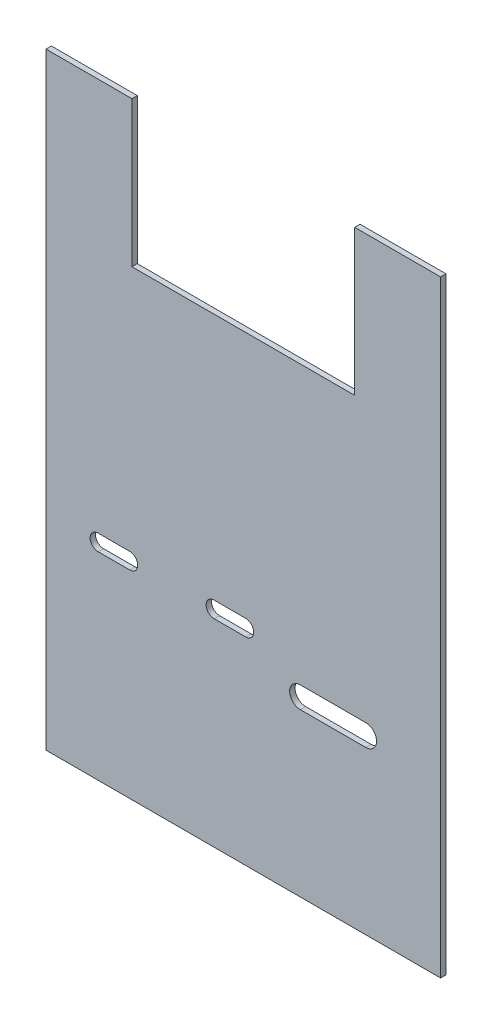
ISO-10303-21;
HEADER;
FILE_DESCRIPTION(('STEP AP214'),'2;1');
FILE_NAME('part.step','',(''),(''),'','','');
FILE_SCHEMA(('AUTOMOTIVE_DESIGN { 1 0 10303 214 1 1 1 1 }'));
ENDSEC;
DATA;
#1=APPLICATION_CONTEXT('core data for automotive mechanical design processes');
#2=APPLICATION_PROTOCOL_DEFINITION('international standard','automotive_design',2000,#1);
#3=PRODUCT_CONTEXT('',#1,'mechanical');
#4=PRODUCT('Part','Part','',(#3));
#5=PRODUCT_RELATED_PRODUCT_CATEGORY('part','',(#4));
#6=PRODUCT_DEFINITION_FORMATION('','',#4);
#7=PRODUCT_DEFINITION_CONTEXT('part definition',#1,'design');
#8=PRODUCT_DEFINITION('design','',#6,#7);
#9=PRODUCT_DEFINITION_SHAPE('','',#8);
#10=(LENGTH_UNIT() NAMED_UNIT(*) SI_UNIT(.MILLI.,.METRE.));
#11=(NAMED_UNIT(*) PLANE_ANGLE_UNIT() SI_UNIT($,.RADIAN.));
#12=(NAMED_UNIT(*) SI_UNIT($,.STERADIAN.) SOLID_ANGLE_UNIT());
#13=UNCERTAINTY_MEASURE_WITH_UNIT(LENGTH_MEASURE(1.E-05),#10,'distance_accuracy_value','');
#14=(GEOMETRIC_REPRESENTATION_CONTEXT(3) GLOBAL_UNCERTAINTY_ASSIGNED_CONTEXT((#13)) GLOBAL_UNIT_ASSIGNED_CONTEXT((#10,
#11,#12)) REPRESENTATION_CONTEXT('',''));
#15=CARTESIAN_POINT('',(0.,0.,0.));
#16=DIRECTION('',(0.,0.,1.));
#17=DIRECTION('',(1.,0.,0.));
#18=AXIS2_PLACEMENT_3D('',#15,#16,#17);
#19=CARTESIAN_POINT('',(-115.,62.1191618381226,2.));
#20=DIRECTION('',(1.,0.,0.));
#21=DIRECTION('',(0.,0.,-1.));
#22=AXIS2_PLACEMENT_3D('',#19,#20,#21);
#23=PLANE('',#22);
#24=DIRECTION('',(0.,-1.,0.));
#25=VECTOR('',#24,1.);
#26=CARTESIAN_POINT('',(-115.,62.1191618381226,0.));
#27=LINE('',#26,#25);
#28=CARTESIAN_POINT('',(-115.,116.342711696557,0.));
#29=VERTEX_POINT('',#28);
#30=CARTESIAN_POINT('',(-115.,-109.880838161877,0.));
#31=VERTEX_POINT('',#30);
#32=EDGE_CURVE('E207',#29,#31,#27,.T.);
#33=ORIENTED_EDGE('',*,*,#32,.T.);
#34=DIRECTION('',(0.,0.,-1.));
#35=VECTOR('',#34,1.);
#36=CARTESIAN_POINT('',(-115.,-109.880838161877,2.));
#37=LINE('',#36,#35);
#38=CARTESIAN_POINT('',(-115.,-109.880838161877,2.));
#39=VERTEX_POINT('',#38);
#40=EDGE_CURVE('E11',#39,#31,#37,.T.);
#41=ORIENTED_EDGE('',*,*,#40,.F.);
#42=DIRECTION('',(0.,-1.,0.));
#43=VECTOR('',#42,1.);
#44=CARTESIAN_POINT('',(-115.,116.342711696557,2.));
#45=LINE('',#44,#43);
#46=CARTESIAN_POINT('',(-115.,116.342711696557,2.));
#47=VERTEX_POINT('',#46);
#48=EDGE_CURVE('E272',#47,#39,#45,.T.);
#49=ORIENTED_EDGE('',*,*,#48,.F.);
#50=DIRECTION('',(0.,0.,-1.));
#51=VECTOR('',#50,1.);
#52=CARTESIAN_POINT('',(-115.,116.342711696557,2.));
#53=LINE('',#52,#51);
#54=EDGE_CURVE('E289',#47,#29,#53,.T.);
#55=ORIENTED_EDGE('',*,*,#54,.T.);
#56=EDGE_LOOP('',(#33,#41,#49,#55));
#57=FACE_BOUND('',#56,.T.);
#58=ADVANCED_FACE('F34',(#57),#23,.F.);
#59=CARTESIAN_POINT('',(-115.,-109.880838161877,2.));
#60=DIRECTION('',(0.,1.,0.));
#61=DIRECTION('',(0.,0.,1.));
#62=AXIS2_PLACEMENT_3D('',#59,#60,#61);
#63=PLANE('',#62);
#64=DIRECTION('',(1.,0.,0.));
#65=VECTOR('',#64,1.);
#66=CARTESIAN_POINT('',(-115.,-109.880838161877,0.));
#67=LINE('',#66,#65);
#68=CARTESIAN_POINT('',(32.0000000000001,-109.880838161877,0.));
#69=VERTEX_POINT('',#68);
#70=EDGE_CURVE('E291',#31,#69,#67,.T.);
#71=ORIENTED_EDGE('',*,*,#70,.T.);
#72=DIRECTION('',(0.,0.,-1.));
#73=VECTOR('',#72,1.);
#74=CARTESIAN_POINT('',(32.0000000000001,-109.880838161877,2.));
#75=LINE('',#74,#73);
#76=CARTESIAN_POINT('',(32.0000000000001,-109.880838161877,2.));
#77=VERTEX_POINT('',#76);
#78=EDGE_CURVE('E41',#77,#69,#75,.T.);
#79=ORIENTED_EDGE('',*,*,#78,.F.);
#80=DIRECTION('',(1.,0.,0.));
#81=VECTOR('',#80,1.);
#82=CARTESIAN_POINT('',(-115.,-109.880838161877,2.));
#83=LINE('',#82,#81);
#84=EDGE_CURVE('E274',#39,#77,#83,.T.);
#85=ORIENTED_EDGE('',*,*,#84,.F.);
#86=ORIENTED_EDGE('',*,*,#40,.T.);
#87=EDGE_LOOP('',(#71,#79,#85,#86));
#88=FACE_BOUND('',#87,.T.);
#89=ADVANCED_FACE('F330',(#88),#63,.F.);
#90=CARTESIAN_POINT('',(32.,116.342711696557,2.));
#91=DIRECTION('',(-1.,0.,0.));
#92=DIRECTION('',(0.,-1.,0.));
#93=AXIS2_PLACEMENT_3D('',#90,#91,#92);
#94=PLANE('',#93);
#95=DIRECTION('',(0.,1.,0.));
#96=VECTOR('',#95,1.);
#97=CARTESIAN_POINT('',(32.,116.342711696557,0.));
#98=LINE('',#97,#96);
#99=CARTESIAN_POINT('',(32.,116.342711696557,0.));
#100=VERTEX_POINT('',#99);
#101=EDGE_CURVE('E294',#69,#100,#98,.T.);
#102=ORIENTED_EDGE('',*,*,#101,.T.);
#103=DIRECTION('',(0.,0.,-1.));
#104=VECTOR('',#103,1.);
#105=CARTESIAN_POINT('',(32.,116.342711696557,2.));
#106=LINE('',#105,#104);
#107=CARTESIAN_POINT('',(32.,116.342711696557,2.));
#108=VERTEX_POINT('',#107);
#109=EDGE_CURVE('E320',#108,#100,#106,.T.);
#110=ORIENTED_EDGE('',*,*,#109,.F.);
#111=DIRECTION('',(0.,1.,0.));
#112=VECTOR('',#111,1.);
#113=CARTESIAN_POINT('',(32.0000000000001,62.1191618381226,2.));
#114=LINE('',#113,#112);
#115=EDGE_CURVE('E277',#77,#108,#114,.T.);
#116=ORIENTED_EDGE('',*,*,#115,.F.);
#117=ORIENTED_EDGE('',*,*,#78,.T.);
#118=EDGE_LOOP('',(#102,#110,#116,#117));
#119=FACE_BOUND('',#118,.T.);
#120=ADVANCED_FACE('F326',(#119),#94,.F.);
#121=CARTESIAN_POINT('',(32.,116.342711696557,2.));
#122=DIRECTION('',(0.,-1.,0.));
#123=DIRECTION('',(0.,0.,-1.));
#124=AXIS2_PLACEMENT_3D('',#121,#122,#123);
#125=PLANE('',#124);
#126=DIRECTION('',(-1.,0.,0.));
#127=VECTOR('',#126,1.);
#128=CARTESIAN_POINT('',(32.,116.342711696557,0.));
#129=LINE('',#128,#127);
#130=CARTESIAN_POINT('',(0.,116.342711696557,0.));
#131=VERTEX_POINT('',#130);
#132=EDGE_CURVE('E296',#100,#131,#129,.T.);
#133=ORIENTED_EDGE('',*,*,#132,.T.);
#134=DIRECTION('',(0.,0.,-1.));
#135=VECTOR('',#134,1.);
#136=CARTESIAN_POINT('',(0.,116.342711696557,2.));
#137=LINE('',#136,#135);
#138=CARTESIAN_POINT('',(0.,116.342711696557,2.));
#139=VERTEX_POINT('',#138);
#140=EDGE_CURVE('E317',#139,#131,#137,.T.);
#141=ORIENTED_EDGE('',*,*,#140,.F.);
#142=DIRECTION('',(-1.,0.,0.));
#143=VECTOR('',#142,1.);
#144=CARTESIAN_POINT('',(32.,116.342711696557,2.));
#145=LINE('',#144,#143);
#146=EDGE_CURVE('E279',#108,#139,#145,.T.);
#147=ORIENTED_EDGE('',*,*,#146,.F.);
#148=ORIENTED_EDGE('',*,*,#109,.T.);
#149=EDGE_LOOP('',(#133,#141,#147,#148));
#150=FACE_BOUND('',#149,.T.);
#151=ADVANCED_FACE('F340',(#150),#125,.F.);
#152=CARTESIAN_POINT('',(0.,116.342711696557,2.));
#153=DIRECTION('',(1.,0.,0.));
#154=DIRECTION('',(0.,1.,0.));
#155=AXIS2_PLACEMENT_3D('',#152,#153,#154);
#156=PLANE('',#155);
#157=DIRECTION('',(0.,-1.,0.));
#158=VECTOR('',#157,1.);
#159=CARTESIAN_POINT('',(0.,116.342711696557,0.));
#160=LINE('',#159,#158);
#161=CARTESIAN_POINT('',(0.,62.1191618381226,0.));
#162=VERTEX_POINT('',#161);
#163=EDGE_CURVE('E298',#131,#162,#160,.T.);
#164=ORIENTED_EDGE('',*,*,#163,.T.);
#165=DIRECTION('',(0.,0.,-1.));
#166=VECTOR('',#165,1.);
#167=CARTESIAN_POINT('',(0.,62.1191618381226,2.));
#168=LINE('',#167,#166);
#169=CARTESIAN_POINT('',(0.,62.1191618381226,2.));
#170=VERTEX_POINT('',#169);
#171=EDGE_CURVE('E314',#170,#162,#168,.T.);
#172=ORIENTED_EDGE('',*,*,#171,.F.);
#173=DIRECTION('',(0.,-1.,0.));
#174=VECTOR('',#173,1.);
#175=CARTESIAN_POINT('',(0.,116.342711696557,2.));
#176=LINE('',#175,#174);
#177=EDGE_CURVE('E281',#139,#170,#176,.T.);
#178=ORIENTED_EDGE('',*,*,#177,.F.);
#179=ORIENTED_EDGE('',*,*,#140,.T.);
#180=EDGE_LOOP('',(#164,#172,#178,#179));
#181=FACE_BOUND('',#180,.T.);
#182=ADVANCED_FACE('F344',(#181),#156,.F.);
#183=CARTESIAN_POINT('',(-83.,62.1191618381226,2.));
#184=DIRECTION('',(0.,-1.,0.));
#185=DIRECTION('',(0.,0.,-1.));
#186=AXIS2_PLACEMENT_3D('',#183,#184,#185);
#187=PLANE('',#186);
#188=DIRECTION('',(-1.,0.,0.));
#189=VECTOR('',#188,1.);
#190=CARTESIAN_POINT('',(-83.,62.1191618381226,0.));
#191=LINE('',#190,#189);
#192=CARTESIAN_POINT('',(-83.,62.1191618381226,0.));
#193=VERTEX_POINT('',#192);
#194=EDGE_CURVE('E300',#162,#193,#191,.T.);
#195=ORIENTED_EDGE('',*,*,#194,.T.);
#196=DIRECTION('',(0.,0.,-1.));
#197=VECTOR('',#196,1.);
#198=CARTESIAN_POINT('',(-83.,62.1191618381226,2.));
#199=LINE('',#198,#197);
#200=CARTESIAN_POINT('',(-83.,62.1191618381226,2.));
#201=VERTEX_POINT('',#200);
#202=EDGE_CURVE('E311',#201,#193,#199,.T.);
#203=ORIENTED_EDGE('',*,*,#202,.F.);
#204=DIRECTION('',(-1.,0.,0.));
#205=VECTOR('',#204,1.);
#206=CARTESIAN_POINT('',(-83.,62.1191618381226,2.));
#207=LINE('',#206,#205);
#208=EDGE_CURVE('E283',#170,#201,#207,.T.);
#209=ORIENTED_EDGE('',*,*,#208,.F.);
#210=ORIENTED_EDGE('',*,*,#171,.T.);
#211=EDGE_LOOP('',(#195,#203,#209,#210));
#212=FACE_BOUND('',#211,.T.);
#213=ADVANCED_FACE('F362',(#212),#187,.F.);
#214=CARTESIAN_POINT('',(-83.,116.342711696557,2.));
#215=DIRECTION('',(-1.,0.,0.));
#216=DIRECTION('',(0.,0.,1.));
#217=AXIS2_PLACEMENT_3D('',#214,#215,#216);
#218=PLANE('',#217);
#219=DIRECTION('',(0.,1.,0.));
#220=VECTOR('',#219,1.);
#221=CARTESIAN_POINT('',(-83.,116.342711696557,0.));
#222=LINE('',#221,#220);
#223=CARTESIAN_POINT('',(-83.,116.342711696557,0.));
#224=VERTEX_POINT('',#223);
#225=EDGE_CURVE('E302',#193,#224,#222,.T.);
#226=ORIENTED_EDGE('',*,*,#225,.T.);
#227=DIRECTION('',(0.,0.,-1.));
#228=VECTOR('',#227,1.);
#229=CARTESIAN_POINT('',(-83.,116.342711696557,2.));
#230=LINE('',#229,#228);
#231=CARTESIAN_POINT('',(-83.,116.342711696557,2.));
#232=VERTEX_POINT('',#231);
#233=EDGE_CURVE('E308',#232,#224,#230,.T.);
#234=ORIENTED_EDGE('',*,*,#233,.F.);
#235=DIRECTION('',(0.,1.,0.));
#236=VECTOR('',#235,1.);
#237=CARTESIAN_POINT('',(-83.,116.342711696557,2.));
#238=LINE('',#237,#236);
#239=EDGE_CURVE('E285',#201,#232,#238,.T.);
#240=ORIENTED_EDGE('',*,*,#239,.F.);
#241=ORIENTED_EDGE('',*,*,#202,.T.);
#242=EDGE_LOOP('',(#226,#234,#240,#241));
#243=FACE_BOUND('',#242,.T.);
#244=ADVANCED_FACE('F359',(#243),#218,.F.);
#245=CARTESIAN_POINT('',(-115.,116.342711696557,2.));
#246=DIRECTION('',(0.,-1.,0.));
#247=DIRECTION('',(0.,0.,-1.));
#248=AXIS2_PLACEMENT_3D('',#245,#246,#247);
#249=PLANE('',#248);
#250=DIRECTION('',(-1.,0.,0.));
#251=VECTOR('',#250,1.);
#252=CARTESIAN_POINT('',(-115.,116.342711696557,0.));
#253=LINE('',#252,#251);
#254=EDGE_CURVE('E275',#224,#29,#253,.T.);
#255=ORIENTED_EDGE('',*,*,#254,.T.);
#256=ORIENTED_EDGE('',*,*,#54,.F.);
#257=DIRECTION('',(-1.,0.,0.));
#258=VECTOR('',#257,1.);
#259=CARTESIAN_POINT('',(-115.,116.342711696557,2.));
#260=LINE('',#259,#258);
#261=EDGE_CURVE('E287',#232,#47,#260,.T.);
#262=ORIENTED_EDGE('',*,*,#261,.F.);
#263=ORIENTED_EDGE('',*,*,#233,.T.);
#264=EDGE_LOOP('',(#255,#256,#262,#263));
#265=FACE_BOUND('',#264,.T.);
#266=ADVANCED_FACE('F355',(#265),#249,.F.);
#267=CARTESIAN_POINT('',(0.,0.,2.));
#268=DIRECTION('',(0.,0.,1.));
#269=DIRECTION('',(1.,0.,0.));
#270=AXIS2_PLACEMENT_3D('',#267,#268,#269);
#271=PLANE('',#270);
#272=CARTESIAN_POINT('',(-95.5726788742055,-33.1357400539359,2.));
#273=DIRECTION('',(0.,0.,1.));
#274=DIRECTION('',(1.,0.,0.));
#275=AXIS2_PLACEMENT_3D('',#272,#273,#274);
#276=CIRCLE('',#275,3.);
#277=CARTESIAN_POINT('',(-95.5726788742055,-30.1357400539359,2.));
#278=VERTEX_POINT('',#277);
#279=CARTESIAN_POINT('',(-95.5726788742055,-36.1357400539359,2.));
#280=VERTEX_POINT('',#279);
#281=EDGE_CURVE('E48',#278,#280,#276,.T.);
#282=ORIENTED_EDGE('',*,*,#281,.F.);
#283=DIRECTION('',(-1.,0.,0.));
#284=VECTOR('',#283,1.);
#285=CARTESIAN_POINT('',(-95.5726788742055,-30.1357400539359,2.));
#286=LINE('',#285,#284);
#287=CARTESIAN_POINT('',(-83.8360957196471,-30.1357400539359,2.));
#288=VERTEX_POINT('',#287);
#289=EDGE_CURVE('E191',#288,#278,#286,.T.);
#290=ORIENTED_EDGE('',*,*,#289,.F.);
#291=CARTESIAN_POINT('',(-83.8360957196471,-33.1357400539359,2.));
#292=DIRECTION('',(0.,0.,1.));
#293=DIRECTION('',(1.,0.,0.));
#294=AXIS2_PLACEMENT_3D('',#291,#292,#293);
#295=CIRCLE('',#294,3.);
#296=CARTESIAN_POINT('',(-83.8360957196471,-36.1357400539359,2.));
#297=VERTEX_POINT('',#296);
#298=EDGE_CURVE('E194',#297,#288,#295,.T.);
#299=ORIENTED_EDGE('',*,*,#298,.F.);
#300=DIRECTION('',(1.,0.,0.));
#301=VECTOR('',#300,1.);
#302=CARTESIAN_POINT('',(-95.5726788742055,-36.1357400539359,2.));
#303=LINE('',#302,#301);
#304=EDGE_CURVE('E200',#280,#297,#303,.T.);
#305=ORIENTED_EDGE('',*,*,#304,.F.);
#306=EDGE_LOOP('',(#282,#290,#299,#305));
#307=FACE_BOUND('',#306,.T.);
#308=CARTESIAN_POINT('',(-52.3581815629334,-33.1357400539359,2.));
#309=DIRECTION('',(0.,0.,1.));
#310=DIRECTION('',(1.,0.,0.));
#311=AXIS2_PLACEMENT_3D('',#308,#309,#310);
#312=CIRCLE('',#311,3.);
#313=CARTESIAN_POINT('',(-52.3581815629334,-30.1357400539359,2.));
#314=VERTEX_POINT('',#313);
#315=CARTESIAN_POINT('',(-52.3581815629334,-36.1357400539359,2.));
#316=VERTEX_POINT('',#315);
#317=EDGE_CURVE('E56',#314,#316,#312,.T.);
#318=ORIENTED_EDGE('',*,*,#317,.F.);
#319=DIRECTION('',(-1.,0.,0.));
#320=VECTOR('',#319,1.);
#321=CARTESIAN_POINT('',(-52.3581815629334,-30.1357400539359,2.));
#322=LINE('',#321,#320);
#323=CARTESIAN_POINT('',(-40.621598408375,-30.1357400539359,2.));
#324=VERTEX_POINT('',#323);
#325=EDGE_CURVE('E215',#324,#314,#322,.T.);
#326=ORIENTED_EDGE('',*,*,#325,.F.);
#327=CARTESIAN_POINT('',(-40.621598408375,-33.1357400539359,2.));
#328=DIRECTION('',(0.,0.,1.));
#329=DIRECTION('',(1.,0.,0.));
#330=AXIS2_PLACEMENT_3D('',#327,#328,#329);
#331=CIRCLE('',#330,3.);
#332=CARTESIAN_POINT('',(-40.621598408375,-36.1357400539359,2.));
#333=VERTEX_POINT('',#332);
#334=EDGE_CURVE('E230',#333,#324,#331,.T.);
#335=ORIENTED_EDGE('',*,*,#334,.F.);
#336=DIRECTION('',(1.,0.,0.));
#337=VECTOR('',#336,1.);
#338=CARTESIAN_POINT('',(-52.3581815629334,-36.1357400539359,2.));
#339=LINE('',#338,#337);
#340=EDGE_CURVE('E226',#316,#333,#339,.T.);
#341=ORIENTED_EDGE('',*,*,#340,.F.);
#342=EDGE_LOOP('',(#318,#326,#335,#341));
#343=FACE_BOUND('',#342,.T.);
#344=CARTESIAN_POINT('',(-20.2274873092571,-45.4311184439881,2.));
#345=DIRECTION('',(0.,0.,1.));
#346=DIRECTION('',(1.,0.,0.));
#347=AXIS2_PLACEMENT_3D('',#344,#345,#346);
#348=CIRCLE('',#347,4.);
#349=CARTESIAN_POINT('',(-20.2274873092571,-41.4311184439881,2.));
#350=VERTEX_POINT('',#349);
#351=CARTESIAN_POINT('',(-20.2274873092571,-49.4311184439881,2.));
#352=VERTEX_POINT('',#351);
#353=EDGE_CURVE('E255',#350,#352,#348,.T.);
#354=ORIENTED_EDGE('',*,*,#353,.F.);
#355=DIRECTION('',(-1.,0.,0.));
#356=VECTOR('',#355,1.);
#357=CARTESIAN_POINT('',(-20.2274873092571,-41.4311184439881,2.));
#358=LINE('',#357,#356);
#359=CARTESIAN_POINT('',(4.13099273000311,-41.4311184439881,2.));
#360=VERTEX_POINT('',#359);
#361=EDGE_CURVE('E245',#360,#350,#358,.T.);
#362=ORIENTED_EDGE('',*,*,#361,.F.);
#363=CARTESIAN_POINT('',(4.13099273000311,-45.4311184439881,2.));
#364=DIRECTION('',(0.,0.,1.));
#365=DIRECTION('',(1.,0.,0.));
#366=AXIS2_PLACEMENT_3D('',#363,#364,#365);
#367=CIRCLE('',#366,4.);
#368=CARTESIAN_POINT('',(4.13099273000311,-49.4311184439881,2.));
#369=VERTEX_POINT('',#368);
#370=EDGE_CURVE('E260',#369,#360,#367,.T.);
#371=ORIENTED_EDGE('',*,*,#370,.F.);
#372=DIRECTION('',(1.,0.,0.));
#373=VECTOR('',#372,1.);
#374=CARTESIAN_POINT('',(-20.2274873092571,-49.4311184439881,2.));
#375=LINE('',#374,#373);
#376=EDGE_CURVE('E257',#352,#369,#375,.T.);
#377=ORIENTED_EDGE('',*,*,#376,.F.);
#378=EDGE_LOOP('',(#354,#362,#371,#377));
#379=FACE_BOUND('',#378,.T.);
#380=ORIENTED_EDGE('',*,*,#48,.T.);
#381=ORIENTED_EDGE('',*,*,#84,.T.);
#382=ORIENTED_EDGE('',*,*,#115,.T.);
#383=ORIENTED_EDGE('',*,*,#146,.T.);
#384=ORIENTED_EDGE('',*,*,#177,.T.);
#385=ORIENTED_EDGE('',*,*,#208,.T.);
#386=ORIENTED_EDGE('',*,*,#239,.T.);
#387=ORIENTED_EDGE('',*,*,#261,.T.);
#388=EDGE_LOOP('',(#380,#381,#382,#383,#384,#385,#386,#387));
#389=FACE_BOUND('',#388,.T.);
#390=ADVANCED_FACE('F348',(#307,#343,#379,#389),#271,.T.);
#391=CARTESIAN_POINT('',(0.,0.,0.));
#392=DIRECTION('',(0.,0.,1.));
#393=DIRECTION('',(1.,0.,0.));
#394=AXIS2_PLACEMENT_3D('',#391,#392,#393);
#395=PLANE('',#394);
#396=DIRECTION('',(-1.,0.,0.));
#397=VECTOR('',#396,1.);
#398=CARTESIAN_POINT('',(-95.5726788742055,-30.1357400539359,0.));
#399=LINE('',#398,#397);
#400=CARTESIAN_POINT('',(-83.8360957196471,-30.1357400539359,0.));
#401=VERTEX_POINT('',#400);
#402=CARTESIAN_POINT('',(-95.5726788742055,-30.1357400539359,0.));
#403=VERTEX_POINT('',#402);
#404=EDGE_CURVE('E178',#401,#403,#399,.T.);
#405=ORIENTED_EDGE('',*,*,#404,.T.);
#406=CARTESIAN_POINT('',(-95.5726788742055,-33.1357400539359,0.));
#407=DIRECTION('',(0.,0.,1.));
#408=DIRECTION('',(1.,0.,0.));
#409=AXIS2_PLACEMENT_3D('',#406,#407,#408);
#410=CIRCLE('',#409,3.);
#411=CARTESIAN_POINT('',(-95.5726788742055,-36.1357400539359,0.));
#412=VERTEX_POINT('',#411);
#413=EDGE_CURVE('E172',#403,#412,#410,.T.);
#414=ORIENTED_EDGE('',*,*,#413,.T.);
#415=DIRECTION('',(1.,0.,0.));
#416=VECTOR('',#415,1.);
#417=CARTESIAN_POINT('',(-95.5726788742055,-36.1357400539359,0.));
#418=LINE('',#417,#416);
#419=CARTESIAN_POINT('',(-83.8360957196471,-36.1357400539359,0.));
#420=VERTEX_POINT('',#419);
#421=EDGE_CURVE('E182',#412,#420,#418,.T.);
#422=ORIENTED_EDGE('',*,*,#421,.T.);
#423=CARTESIAN_POINT('',(-83.8360957196471,-33.1357400539359,0.));
#424=DIRECTION('',(0.,0.,1.));
#425=DIRECTION('',(1.,0.,0.));
#426=AXIS2_PLACEMENT_3D('',#423,#424,#425);
#427=CIRCLE('',#426,3.);
#428=EDGE_CURVE('E186',#420,#401,#427,.T.);
#429=ORIENTED_EDGE('',*,*,#428,.T.);
#430=EDGE_LOOP('',(#405,#414,#422,#429));
#431=FACE_BOUND('',#430,.T.);
#432=DIRECTION('',(-1.,0.,0.));
#433=VECTOR('',#432,1.);
#434=CARTESIAN_POINT('',(-52.3581815629334,-30.1357400539359,0.));
#435=LINE('',#434,#433);
#436=CARTESIAN_POINT('',(-40.621598408375,-30.1357400539359,0.));
#437=VERTEX_POINT('',#436);
#438=CARTESIAN_POINT('',(-52.3581815629334,-30.1357400539359,0.));
#439=VERTEX_POINT('',#438);
#440=EDGE_CURVE('E221',#437,#439,#435,.T.);
#441=ORIENTED_EDGE('',*,*,#440,.T.);
#442=CARTESIAN_POINT('',(-52.3581815629334,-33.1357400539359,0.));
#443=DIRECTION('',(0.,0.,1.));
#444=DIRECTION('',(1.,0.,0.));
#445=AXIS2_PLACEMENT_3D('',#442,#443,#444);
#446=CIRCLE('',#445,3.);
#447=CARTESIAN_POINT('',(-52.3581815629334,-36.1357400539359,0.));
#448=VERTEX_POINT('',#447);
#449=EDGE_CURVE('E211',#439,#448,#446,.T.);
#450=ORIENTED_EDGE('',*,*,#449,.T.);
#451=DIRECTION('',(1.,0.,0.));
#452=VECTOR('',#451,1.);
#453=CARTESIAN_POINT('',(-52.3581815629334,-36.1357400539359,0.));
#454=LINE('',#453,#452);
#455=CARTESIAN_POINT('',(-40.621598408375,-36.1357400539359,0.));
#456=VERTEX_POINT('',#455);
#457=EDGE_CURVE('E214',#448,#456,#454,.T.);
#458=ORIENTED_EDGE('',*,*,#457,.T.);
#459=CARTESIAN_POINT('',(-40.621598408375,-33.1357400539359,0.));
#460=DIRECTION('',(0.,0.,1.));
#461=DIRECTION('',(1.,0.,0.));
#462=AXIS2_PLACEMENT_3D('',#459,#460,#461);
#463=CIRCLE('',#462,3.);
#464=EDGE_CURVE('E218',#456,#437,#463,.T.);
#465=ORIENTED_EDGE('',*,*,#464,.T.);
#466=EDGE_LOOP('',(#441,#450,#458,#465));
#467=FACE_BOUND('',#466,.T.);
#468=DIRECTION('',(-1.,0.,0.));
#469=VECTOR('',#468,1.);
#470=CARTESIAN_POINT('',(-20.2274873092571,-41.4311184439881,0.));
#471=LINE('',#470,#469);
#472=CARTESIAN_POINT('',(4.13099273000311,-41.4311184439881,0.));
#473=VERTEX_POINT('',#472);
#474=CARTESIAN_POINT('',(-20.2274873092571,-41.4311184439881,0.));
#475=VERTEX_POINT('',#474);
#476=EDGE_CURVE('E251',#473,#475,#471,.T.);
#477=ORIENTED_EDGE('',*,*,#476,.T.);
#478=CARTESIAN_POINT('',(-20.2274873092571,-45.4311184439881,0.));
#479=DIRECTION('',(0.,0.,1.));
#480=DIRECTION('',(1.,0.,0.));
#481=AXIS2_PLACEMENT_3D('',#478,#479,#480);
#482=CIRCLE('',#481,4.);
#483=CARTESIAN_POINT('',(-20.2274873092571,-49.4311184439881,0.));
#484=VERTEX_POINT('',#483);
#485=EDGE_CURVE('E241',#475,#484,#482,.T.);
#486=ORIENTED_EDGE('',*,*,#485,.T.);
#487=DIRECTION('',(1.,0.,0.));
#488=VECTOR('',#487,1.);
#489=CARTESIAN_POINT('',(-20.2274873092571,-49.4311184439881,0.));
#490=LINE('',#489,#488);
#491=CARTESIAN_POINT('',(4.13099273000311,-49.4311184439881,0.));
#492=VERTEX_POINT('',#491);
#493=EDGE_CURVE('E244',#484,#492,#490,.T.);
#494=ORIENTED_EDGE('',*,*,#493,.T.);
#495=CARTESIAN_POINT('',(4.13099273000311,-45.4311184439881,0.));
#496=DIRECTION('',(0.,0.,1.));
#497=DIRECTION('',(1.,0.,0.));
#498=AXIS2_PLACEMENT_3D('',#495,#496,#497);
#499=CIRCLE('',#498,4.);
#500=EDGE_CURVE('E248',#492,#473,#499,.T.);
#501=ORIENTED_EDGE('',*,*,#500,.T.);
#502=EDGE_LOOP('',(#477,#486,#494,#501));
#503=FACE_BOUND('',#502,.T.);
#504=ORIENTED_EDGE('',*,*,#32,.F.);
#505=ORIENTED_EDGE('',*,*,#254,.F.);
#506=ORIENTED_EDGE('',*,*,#225,.F.);
#507=ORIENTED_EDGE('',*,*,#194,.F.);
#508=ORIENTED_EDGE('',*,*,#163,.F.);
#509=ORIENTED_EDGE('',*,*,#132,.F.);
#510=ORIENTED_EDGE('',*,*,#101,.F.);
#511=ORIENTED_EDGE('',*,*,#70,.F.);
#512=EDGE_LOOP('',(#504,#505,#506,#507,#508,#509,#510,#511));
#513=FACE_BOUND('',#512,.T.);
#514=ADVANCED_FACE('F188',(#431,#467,#503,#513),#395,.F.);
#515=CARTESIAN_POINT('',(-20.2274873092571,-45.4311184439881,0.));
#516=DIRECTION('',(0.,0.,1.));
#517=DIRECTION('',(1.,0.,0.));
#518=AXIS2_PLACEMENT_3D('',#515,#516,#517);
#519=CYLINDRICAL_SURFACE('',#518,4.);
#520=ORIENTED_EDGE('',*,*,#353,.T.);
#521=DIRECTION('',(0.,0.,1.));
#522=VECTOR('',#521,1.);
#523=CARTESIAN_POINT('',(-20.2274873092571,-49.4311184439881,0.));
#524=LINE('',#523,#522);
#525=EDGE_CURVE('E254',#484,#352,#524,.T.);
#526=ORIENTED_EDGE('',*,*,#525,.F.);
#527=ORIENTED_EDGE('',*,*,#485,.F.);
#528=DIRECTION('',(0.,0.,1.));
#529=VECTOR('',#528,1.);
#530=CARTESIAN_POINT('',(-20.2274873092571,-41.4311184439881,0.));
#531=LINE('',#530,#529);
#532=EDGE_CURVE('E227',#475,#350,#531,.T.);
#533=ORIENTED_EDGE('',*,*,#532,.T.);
#534=EDGE_LOOP('',(#520,#526,#527,#533));
#535=FACE_BOUND('',#534,.T.);
#536=ADVANCED_FACE('F425',(#535),#519,.F.);
#537=CARTESIAN_POINT('',(-20.2274873092571,-41.4311184439881,0.));
#538=DIRECTION('',(0.,1.,0.));
#539=DIRECTION('',(0.,0.,1.));
#540=AXIS2_PLACEMENT_3D('',#537,#538,#539);
#541=PLANE('',#540);
#542=ORIENTED_EDGE('',*,*,#361,.T.);
#543=ORIENTED_EDGE('',*,*,#532,.F.);
#544=ORIENTED_EDGE('',*,*,#476,.F.);
#545=DIRECTION('',(0.,0.,1.));
#546=VECTOR('',#545,1.);
#547=CARTESIAN_POINT('',(4.13099273000311,-41.4311184439881,0.));
#548=LINE('',#547,#546);
#549=EDGE_CURVE('E266',#473,#360,#548,.T.);
#550=ORIENTED_EDGE('',*,*,#549,.T.);
#551=EDGE_LOOP('',(#542,#543,#544,#550));
#552=FACE_BOUND('',#551,.T.);
#553=ADVANCED_FACE('F434',(#552),#541,.F.);
#554=CARTESIAN_POINT('',(4.13099273000311,-45.4311184439881,0.));
#555=DIRECTION('',(0.,0.,1.));
#556=DIRECTION('',(1.,0.,0.));
#557=AXIS2_PLACEMENT_3D('',#554,#555,#556);
#558=CYLINDRICAL_SURFACE('',#557,4.);
#559=ORIENTED_EDGE('',*,*,#370,.T.);
#560=ORIENTED_EDGE('',*,*,#549,.F.);
#561=ORIENTED_EDGE('',*,*,#500,.F.);
#562=DIRECTION('',(0.,0.,1.));
#563=VECTOR('',#562,1.);
#564=CARTESIAN_POINT('',(4.13099273000311,-49.4311184439881,0.));
#565=LINE('',#564,#563);
#566=EDGE_CURVE('E268',#492,#369,#565,.T.);
#567=ORIENTED_EDGE('',*,*,#566,.T.);
#568=EDGE_LOOP('',(#559,#560,#561,#567));
#569=FACE_BOUND('',#568,.T.);
#570=ADVANCED_FACE('F444',(#569),#558,.F.);
#571=CARTESIAN_POINT('',(-20.2274873092571,-49.4311184439881,0.));
#572=DIRECTION('',(0.,-1.,0.));
#573=DIRECTION('',(0.,0.,-1.));
#574=AXIS2_PLACEMENT_3D('',#571,#572,#573);
#575=PLANE('',#574);
#576=ORIENTED_EDGE('',*,*,#376,.T.);
#577=ORIENTED_EDGE('',*,*,#566,.F.);
#578=ORIENTED_EDGE('',*,*,#493,.F.);
#579=ORIENTED_EDGE('',*,*,#525,.T.);
#580=EDGE_LOOP('',(#576,#577,#578,#579));
#581=FACE_BOUND('',#580,.T.);
#582=ADVANCED_FACE('F454',(#581),#575,.F.);
#583=CARTESIAN_POINT('',(-52.3581815629334,-33.1357400539359,0.));
#584=DIRECTION('',(0.,0.,1.));
#585=DIRECTION('',(1.,0.,0.));
#586=AXIS2_PLACEMENT_3D('',#583,#584,#585);
#587=CYLINDRICAL_SURFACE('',#586,3.);
#588=ORIENTED_EDGE('',*,*,#317,.T.);
#589=DIRECTION('',(0.,0.,1.));
#590=VECTOR('',#589,1.);
#591=CARTESIAN_POINT('',(-52.3581815629334,-36.1357400539359,0.));
#592=LINE('',#591,#590);
#593=EDGE_CURVE('E224',#448,#316,#592,.T.);
#594=ORIENTED_EDGE('',*,*,#593,.F.);
#595=ORIENTED_EDGE('',*,*,#449,.F.);
#596=DIRECTION('',(0.,0.,1.));
#597=VECTOR('',#596,1.);
#598=CARTESIAN_POINT('',(-52.3581815629334,-30.1357400539359,0.));
#599=LINE('',#598,#597);
#600=EDGE_CURVE('E201',#439,#314,#599,.T.);
#601=ORIENTED_EDGE('',*,*,#600,.T.);
#602=EDGE_LOOP('',(#588,#594,#595,#601));
#603=FACE_BOUND('',#602,.T.);
#604=ADVANCED_FACE('F464',(#603),#587,.F.);
#605=CARTESIAN_POINT('',(-52.3581815629334,-30.1357400539359,0.));
#606=DIRECTION('',(0.,1.,0.));
#607=DIRECTION('',(0.,0.,1.));
#608=AXIS2_PLACEMENT_3D('',#605,#606,#607);
#609=PLANE('',#608);
#610=ORIENTED_EDGE('',*,*,#325,.T.);
#611=ORIENTED_EDGE('',*,*,#600,.F.);
#612=ORIENTED_EDGE('',*,*,#440,.F.);
#613=DIRECTION('',(0.,0.,1.));
#614=VECTOR('',#613,1.);
#615=CARTESIAN_POINT('',(-40.621598408375,-30.1357400539359,0.));
#616=LINE('',#615,#614);
#617=EDGE_CURVE('E236',#437,#324,#616,.T.);
#618=ORIENTED_EDGE('',*,*,#617,.T.);
#619=EDGE_LOOP('',(#610,#611,#612,#618));
#620=FACE_BOUND('',#619,.T.);
#621=ADVANCED_FACE('F474',(#620),#609,.F.);
#622=CARTESIAN_POINT('',(-40.621598408375,-33.1357400539359,0.));
#623=DIRECTION('',(0.,0.,1.));
#624=DIRECTION('',(1.,0.,0.));
#625=AXIS2_PLACEMENT_3D('',#622,#623,#624);
#626=CYLINDRICAL_SURFACE('',#625,3.);
#627=ORIENTED_EDGE('',*,*,#334,.T.);
#628=ORIENTED_EDGE('',*,*,#617,.F.);
#629=ORIENTED_EDGE('',*,*,#464,.F.);
#630=DIRECTION('',(0.,0.,1.));
#631=VECTOR('',#630,1.);
#632=CARTESIAN_POINT('',(-40.621598408375,-36.1357400539359,0.));
#633=LINE('',#632,#631);
#634=EDGE_CURVE('E238',#456,#333,#633,.T.);
#635=ORIENTED_EDGE('',*,*,#634,.T.);
#636=EDGE_LOOP('',(#627,#628,#629,#635));
#637=FACE_BOUND('',#636,.T.);
#638=ADVANCED_FACE('F483',(#637),#626,.F.);
#639=CARTESIAN_POINT('',(-52.3581815629334,-36.1357400539359,0.));
#640=DIRECTION('',(0.,-1.,0.));
#641=DIRECTION('',(0.,0.,-1.));
#642=AXIS2_PLACEMENT_3D('',#639,#640,#641);
#643=PLANE('',#642);
#644=ORIENTED_EDGE('',*,*,#340,.T.);
#645=ORIENTED_EDGE('',*,*,#634,.F.);
#646=ORIENTED_EDGE('',*,*,#457,.F.);
#647=ORIENTED_EDGE('',*,*,#593,.T.);
#648=EDGE_LOOP('',(#644,#645,#646,#647));
#649=FACE_BOUND('',#648,.T.);
#650=ADVANCED_FACE('F493',(#649),#643,.F.);
#651=CARTESIAN_POINT('',(-95.5726788742055,-33.1357400539359,0.));
#652=DIRECTION('',(0.,0.,1.));
#653=DIRECTION('',(1.,0.,0.));
#654=AXIS2_PLACEMENT_3D('',#651,#652,#653);
#655=CYLINDRICAL_SURFACE('',#654,3.);
#656=ORIENTED_EDGE('',*,*,#281,.T.);
#657=DIRECTION('',(0.,0.,1.));
#658=VECTOR('',#657,1.);
#659=CARTESIAN_POINT('',(-95.5726788742055,-36.1357400539359,0.));
#660=LINE('',#659,#658);
#661=EDGE_CURVE('E168',#412,#280,#660,.T.);
#662=ORIENTED_EDGE('',*,*,#661,.F.);
#663=ORIENTED_EDGE('',*,*,#413,.F.);
#664=DIRECTION('',(0.,0.,1.));
#665=VECTOR('',#664,1.);
#666=CARTESIAN_POINT('',(-95.5726788742055,-30.1357400539359,0.));
#667=LINE('',#666,#665);
#668=EDGE_CURVE('E205',#403,#278,#667,.T.);
#669=ORIENTED_EDGE('',*,*,#668,.T.);
#670=EDGE_LOOP('',(#656,#662,#663,#669));
#671=FACE_BOUND('',#670,.T.);
#672=ADVANCED_FACE('F170',(#671),#655,.F.);
#673=CARTESIAN_POINT('',(-95.5726788742055,-30.1357400539359,0.));
#674=DIRECTION('',(0.,1.,0.));
#675=DIRECTION('',(0.,0.,1.));
#676=AXIS2_PLACEMENT_3D('',#673,#674,#675);
#677=PLANE('',#676);
#678=ORIENTED_EDGE('',*,*,#289,.T.);
#679=ORIENTED_EDGE('',*,*,#668,.F.);
#680=ORIENTED_EDGE('',*,*,#404,.F.);
#681=DIRECTION('',(0.,0.,1.));
#682=VECTOR('',#681,1.);
#683=CARTESIAN_POINT('',(-83.8360957196471,-30.1357400539359,0.));
#684=LINE('',#683,#682);
#685=EDGE_CURVE('E208',#401,#288,#684,.T.);
#686=ORIENTED_EDGE('',*,*,#685,.T.);
#687=EDGE_LOOP('',(#678,#679,#680,#686));
#688=FACE_BOUND('',#687,.T.);
#689=ADVANCED_FACE('F512',(#688),#677,.F.);
#690=CARTESIAN_POINT('',(-83.8360957196471,-33.1357400539359,0.));
#691=DIRECTION('',(0.,0.,1.));
#692=DIRECTION('',(1.,0.,0.));
#693=AXIS2_PLACEMENT_3D('',#690,#691,#692);
#694=CYLINDRICAL_SURFACE('',#693,3.);
#695=ORIENTED_EDGE('',*,*,#298,.T.);
#696=ORIENTED_EDGE('',*,*,#685,.F.);
#697=ORIENTED_EDGE('',*,*,#428,.F.);
#698=DIRECTION('',(0.,0.,1.));
#699=VECTOR('',#698,1.);
#700=CARTESIAN_POINT('',(-83.8360957196471,-36.1357400539359,0.));
#701=LINE('',#700,#699);
#702=EDGE_CURVE('E177',#420,#297,#701,.T.);
#703=ORIENTED_EDGE('',*,*,#702,.T.);
#704=EDGE_LOOP('',(#695,#696,#697,#703));
#705=FACE_BOUND('',#704,.T.);
#706=ADVANCED_FACE('F521',(#705),#694,.F.);
#707=CARTESIAN_POINT('',(-95.5726788742055,-36.1357400539359,0.));
#708=DIRECTION('',(0.,-1.,0.));
#709=DIRECTION('',(0.,0.,-1.));
#710=AXIS2_PLACEMENT_3D('',#707,#708,#709);
#711=PLANE('',#710);
#712=ORIENTED_EDGE('',*,*,#304,.T.);
#713=ORIENTED_EDGE('',*,*,#702,.F.);
#714=ORIENTED_EDGE('',*,*,#421,.F.);
#715=ORIENTED_EDGE('',*,*,#661,.T.);
#716=EDGE_LOOP('',(#712,#713,#714,#715));
#717=FACE_BOUND('',#716,.T.);
#718=ADVANCED_FACE('F183',(#717),#711,.F.);
#719=CLOSED_SHELL('',(#58,#89,#120,#151,#182,#213,#244,#266,#390,#514,#536,#553,#570,#582,#604,
#621,#638,#650,#672,#689,#706,#718));
#720=MANIFOLD_SOLID_BREP('B2',#719);
#721=ADVANCED_BREP_SHAPE_REPRESENTATION('',(#18,#720),#14);
#722=SHAPE_DEFINITION_REPRESENTATION(#9,#721);
ENDSEC;
END-ISO-10303-21;
